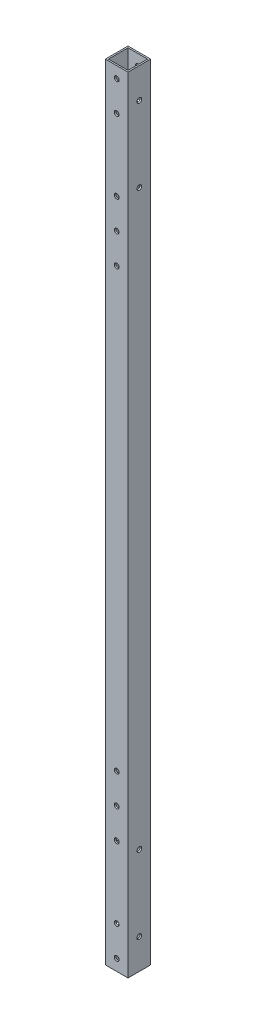
ISO-10303-21;
HEADER;
FILE_DESCRIPTION(('STEP AP214'),'2;1');
FILE_NAME('part.step','',(''),(''),'','','');
FILE_SCHEMA(('AUTOMOTIVE_DESIGN { 1 0 10303 214 1 1 1 1 }'));
ENDSEC;
DATA;
#1=APPLICATION_CONTEXT('core data for automotive mechanical design processes');
#2=APPLICATION_PROTOCOL_DEFINITION('international standard','automotive_design',2000,#1);
#3=PRODUCT_CONTEXT('',#1,'mechanical');
#4=PRODUCT('Part','Part','',(#3));
#5=PRODUCT_RELATED_PRODUCT_CATEGORY('part','',(#4));
#6=PRODUCT_DEFINITION_FORMATION('','',#4);
#7=PRODUCT_DEFINITION_CONTEXT('part definition',#1,'design');
#8=PRODUCT_DEFINITION('design','',#6,#7);
#9=PRODUCT_DEFINITION_SHAPE('','',#8);
#10=(LENGTH_UNIT() NAMED_UNIT(*) SI_UNIT(.MILLI.,.METRE.));
#11=(NAMED_UNIT(*) PLANE_ANGLE_UNIT() SI_UNIT($,.RADIAN.));
#12=(NAMED_UNIT(*) SI_UNIT($,.STERADIAN.) SOLID_ANGLE_UNIT());
#13=UNCERTAINTY_MEASURE_WITH_UNIT(LENGTH_MEASURE(1.E-05),#10,'distance_accuracy_value','');
#14=(GEOMETRIC_REPRESENTATION_CONTEXT(3) GLOBAL_UNCERTAINTY_ASSIGNED_CONTEXT((#13)) GLOBAL_UNIT_ASSIGNED_CONTEXT((#10,
#11,#12)) REPRESENTATION_CONTEXT('',''));
#15=CARTESIAN_POINT('',(0.,0.,0.));
#16=DIRECTION('',(0.,0.,1.));
#17=DIRECTION('',(1.,0.,0.));
#18=AXIS2_PLACEMENT_3D('',#15,#16,#17);
#19=CARTESIAN_POINT('',(0.,520.,0.));
#20=DIRECTION('',(0.,1.,0.));
#21=DIRECTION('',(0.,0.,1.));
#22=AXIS2_PLACEMENT_3D('',#19,#20,#21);
#23=PLANE('',#22);
#24=DIRECTION('',(0.,0.,-1.));
#25=VECTOR('',#24,1.);
#26=CARTESIAN_POINT('',(7.5,520.,7.5));
#27=LINE('',#26,#25);
#28=CARTESIAN_POINT('',(7.5,520.,7.5));
#29=VERTEX_POINT('',#28);
#30=CARTESIAN_POINT('',(7.5,520.,-7.5));
#31=VERTEX_POINT('',#30);
#32=EDGE_CURVE('E186',#29,#31,#27,.T.);
#33=ORIENTED_EDGE('',*,*,#32,.T.);
#34=DIRECTION('',(-1.,0.,0.));
#35=VECTOR('',#34,1.);
#36=CARTESIAN_POINT('',(-7.5,520.,-7.5));
#37=LINE('',#36,#35);
#38=CARTESIAN_POINT('',(-7.5,520.,-7.5));
#39=VERTEX_POINT('',#38);
#40=EDGE_CURVE('E190',#31,#39,#37,.T.);
#41=ORIENTED_EDGE('',*,*,#40,.T.);
#42=DIRECTION('',(0.,0.,1.));
#43=VECTOR('',#42,1.);
#44=CARTESIAN_POINT('',(-7.5,520.,7.5));
#45=LINE('',#44,#43);
#46=CARTESIAN_POINT('',(-7.5,520.,7.5));
#47=VERTEX_POINT('',#46);
#48=EDGE_CURVE('E194',#39,#47,#45,.T.);
#49=ORIENTED_EDGE('',*,*,#48,.T.);
#50=DIRECTION('',(1.,0.,0.));
#51=VECTOR('',#50,1.);
#52=CARTESIAN_POINT('',(-7.5,520.,7.5));
#53=LINE('',#52,#51);
#54=EDGE_CURVE('E197',#47,#29,#53,.T.);
#55=ORIENTED_EDGE('',*,*,#54,.T.);
#56=EDGE_LOOP('',(#33,#41,#49,#55));
#57=FACE_BOUND('',#56,.T.);
#58=DIRECTION('',(-1.,0.,0.));
#59=VECTOR('',#58,1.);
#60=CARTESIAN_POINT('',(0.,520.,-6.5));
#61=LINE('',#60,#59);
#62=CARTESIAN_POINT('',(6.5,520.,-6.5));
#63=VERTEX_POINT('',#62);
#64=CARTESIAN_POINT('',(-6.5,520.,-6.5));
#65=VERTEX_POINT('',#64);
#66=EDGE_CURVE('E145',#63,#65,#61,.T.);
#67=ORIENTED_EDGE('',*,*,#66,.F.);
#68=DIRECTION('',(0.,0.,-1.));
#69=VECTOR('',#68,1.);
#70=CARTESIAN_POINT('',(6.5,520.,0.));
#71=LINE('',#70,#69);
#72=CARTESIAN_POINT('',(6.5,520.,6.5));
#73=VERTEX_POINT('',#72);
#74=EDGE_CURVE('E136',#73,#63,#71,.T.);
#75=ORIENTED_EDGE('',*,*,#74,.F.);
#76=DIRECTION('',(1.,0.,0.));
#77=VECTOR('',#76,1.);
#78=CARTESIAN_POINT('',(0.,520.,6.5));
#79=LINE('',#78,#77);
#80=CARTESIAN_POINT('',(-6.5,520.,6.5));
#81=VERTEX_POINT('',#80);
#82=EDGE_CURVE('E162',#81,#73,#79,.T.);
#83=ORIENTED_EDGE('',*,*,#82,.F.);
#84=DIRECTION('',(0.,0.,1.));
#85=VECTOR('',#84,1.);
#86=CARTESIAN_POINT('',(-6.5,520.,0.));
#87=LINE('',#86,#85);
#88=EDGE_CURVE('E158',#65,#81,#87,.T.);
#89=ORIENTED_EDGE('',*,*,#88,.F.);
#90=EDGE_LOOP('',(#67,#75,#83,#89));
#91=FACE_BOUND('',#90,.T.);
#92=ADVANCED_FACE('F68',(#57,#91),#23,.T.);
#93=CARTESIAN_POINT('',(0.,0.,0.));
#94=DIRECTION('',(0.,1.,0.));
#95=DIRECTION('',(0.,0.,1.));
#96=AXIS2_PLACEMENT_3D('',#93,#94,#95);
#97=PLANE('',#96);
#98=DIRECTION('',(0.,0.,-1.));
#99=VECTOR('',#98,1.);
#100=CARTESIAN_POINT('',(7.5,0.,7.5));
#101=LINE('',#100,#99);
#102=CARTESIAN_POINT('',(7.5,0.,7.5));
#103=VERTEX_POINT('',#102);
#104=CARTESIAN_POINT('',(7.5,0.,-7.5));
#105=VERTEX_POINT('',#104);
#106=EDGE_CURVE('E154',#103,#105,#101,.T.);
#107=ORIENTED_EDGE('',*,*,#106,.F.);
#108=DIRECTION('',(1.,0.,0.));
#109=VECTOR('',#108,1.);
#110=CARTESIAN_POINT('',(-7.5,0.,7.5));
#111=LINE('',#110,#109);
#112=CARTESIAN_POINT('',(-7.5,0.,7.5));
#113=VERTEX_POINT('',#112);
#114=EDGE_CURVE('E191',#113,#103,#111,.T.);
#115=ORIENTED_EDGE('',*,*,#114,.F.);
#116=DIRECTION('',(0.,0.,1.));
#117=VECTOR('',#116,1.);
#118=CARTESIAN_POINT('',(-7.5,0.,7.5));
#119=LINE('',#118,#117);
#120=CARTESIAN_POINT('',(-7.5,0.,-7.5));
#121=VERTEX_POINT('',#120);
#122=EDGE_CURVE('E207',#121,#113,#119,.T.);
#123=ORIENTED_EDGE('',*,*,#122,.F.);
#124=DIRECTION('',(-1.,0.,0.));
#125=VECTOR('',#124,1.);
#126=CARTESIAN_POINT('',(-7.5,0.,-7.5));
#127=LINE('',#126,#125);
#128=EDGE_CURVE('E204',#105,#121,#127,.T.);
#129=ORIENTED_EDGE('',*,*,#128,.F.);
#130=EDGE_LOOP('',(#107,#115,#123,#129));
#131=FACE_BOUND('',#130,.T.);
#132=DIRECTION('',(0.,0.,-1.));
#133=VECTOR('',#132,1.);
#134=CARTESIAN_POINT('',(6.5,0.,0.));
#135=LINE('',#134,#133);
#136=CARTESIAN_POINT('',(6.5,0.,6.5));
#137=VERTEX_POINT('',#136);
#138=CARTESIAN_POINT('',(6.5,0.,-6.5));
#139=VERTEX_POINT('',#138);
#140=EDGE_CURVE('E94',#137,#139,#135,.T.);
#141=ORIENTED_EDGE('',*,*,#140,.T.);
#142=DIRECTION('',(-1.,0.,0.));
#143=VECTOR('',#142,1.);
#144=CARTESIAN_POINT('',(0.,0.,-6.5));
#145=LINE('',#144,#143);
#146=CARTESIAN_POINT('',(-6.5,0.,-6.5));
#147=VERTEX_POINT('',#146);
#148=EDGE_CURVE('E152',#139,#147,#145,.T.);
#149=ORIENTED_EDGE('',*,*,#148,.T.);
#150=DIRECTION('',(0.,0.,1.));
#151=VECTOR('',#150,1.);
#152=CARTESIAN_POINT('',(-6.5,0.,0.));
#153=LINE('',#152,#151);
#154=CARTESIAN_POINT('',(-6.5,0.,6.5));
#155=VERTEX_POINT('',#154);
#156=EDGE_CURVE('E173',#147,#155,#153,.T.);
#157=ORIENTED_EDGE('',*,*,#156,.T.);
#158=DIRECTION('',(1.,0.,0.));
#159=VECTOR('',#158,1.);
#160=CARTESIAN_POINT('',(0.,0.,6.5));
#161=LINE('',#160,#159);
#162=EDGE_CURVE('E146',#155,#137,#161,.T.);
#163=ORIENTED_EDGE('',*,*,#162,.T.);
#164=EDGE_LOOP('',(#141,#149,#157,#163));
#165=FACE_BOUND('',#164,.T.);
#166=ADVANCED_FACE('F460',(#131,#165),#97,.F.);
#167=CARTESIAN_POINT('',(7.5,520.,7.5));
#168=DIRECTION('',(-1.,0.,0.));
#169=DIRECTION('',(0.,0.,1.));
#170=AXIS2_PLACEMENT_3D('',#167,#168,#169);
#171=PLANE('',#170);
#172=CARTESIAN_POINT('',(7.5,20.,0.));
#173=DIRECTION('',(1.,0.,0.));
#174=DIRECTION('',(0.,0.,-1.));
#175=AXIS2_PLACEMENT_3D('',#172,#173,#174);
#176=CIRCLE('',#175,1.6);
#177=CARTESIAN_POINT('',(7.5,20.,-1.6));
#178=VERTEX_POINT('',#177);
#179=EDGE_CURVE('E519',#178,#178,#176,.T.);
#180=ORIENTED_EDGE('',*,*,#179,.F.);
#181=EDGE_LOOP('',(#180));
#182=FACE_BOUND('',#181,.T.);
#183=CARTESIAN_POINT('',(7.5,70.,0.));
#184=DIRECTION('',(1.,0.,0.));
#185=DIRECTION('',(0.,0.,-1.));
#186=AXIS2_PLACEMENT_3D('',#183,#184,#185);
#187=CIRCLE('',#186,1.6);
#188=CARTESIAN_POINT('',(7.5,70.,-1.6));
#189=VERTEX_POINT('',#188);
#190=EDGE_CURVE('E515',#189,#189,#187,.T.);
#191=ORIENTED_EDGE('',*,*,#190,.F.);
#192=EDGE_LOOP('',(#191));
#193=FACE_BOUND('',#192,.T.);
#194=CARTESIAN_POINT('',(7.5,450.,0.));
#195=DIRECTION('',(1.,0.,0.));
#196=DIRECTION('',(0.,0.,1.));
#197=AXIS2_PLACEMENT_3D('',#194,#195,#196);
#198=CIRCLE('',#197,1.59999999999999);
#199=CARTESIAN_POINT('',(7.5,450.,1.59999999999999));
#200=VERTEX_POINT('',#199);
#201=EDGE_CURVE('E509',#200,#200,#198,.T.);
#202=ORIENTED_EDGE('',*,*,#201,.F.);
#203=EDGE_LOOP('',(#202));
#204=FACE_BOUND('',#203,.T.);
#205=CARTESIAN_POINT('',(7.5,500.,0.));
#206=DIRECTION('',(1.,0.,0.));
#207=DIRECTION('',(0.,0.,1.));
#208=AXIS2_PLACEMENT_3D('',#205,#206,#207);
#209=CIRCLE('',#208,1.6);
#210=CARTESIAN_POINT('',(7.5,500.,1.6));
#211=VERTEX_POINT('',#210);
#212=EDGE_CURVE('E502',#211,#211,#209,.T.);
#213=ORIENTED_EDGE('',*,*,#212,.F.);
#214=EDGE_LOOP('',(#213));
#215=FACE_BOUND('',#214,.T.);
#216=ORIENTED_EDGE('',*,*,#106,.T.);
#217=DIRECTION('',(0.,-1.,0.));
#218=VECTOR('',#217,1.);
#219=CARTESIAN_POINT('',(7.5,520.,-7.5));
#220=LINE('',#219,#218);
#221=EDGE_CURVE('E12',#31,#105,#220,.T.);
#222=ORIENTED_EDGE('',*,*,#221,.F.);
#223=ORIENTED_EDGE('',*,*,#32,.F.);
#224=DIRECTION('',(0.,-1.,0.));
#225=VECTOR('',#224,1.);
#226=CARTESIAN_POINT('',(7.5,520.,7.5));
#227=LINE('',#226,#225);
#228=EDGE_CURVE('E200',#29,#103,#227,.T.);
#229=ORIENTED_EDGE('',*,*,#228,.T.);
#230=EDGE_LOOP('',(#216,#222,#223,#229));
#231=FACE_BOUND('',#230,.T.);
#232=ADVANCED_FACE('F70',(#182,#193,#204,#215,#231),#171,.F.);
#233=CARTESIAN_POINT('',(-7.5,520.,-7.5));
#234=DIRECTION('',(0.,0.,1.));
#235=DIRECTION('',(1.,0.,0.));
#236=AXIS2_PLACEMENT_3D('',#233,#234,#235);
#237=PLANE('',#236);
#238=CARTESIAN_POINT('',(0.,7.5,-7.5));
#239=DIRECTION('',(0.,0.,1.));
#240=DIRECTION('',(1.,0.,0.));
#241=AXIS2_PLACEMENT_3D('',#238,#239,#240);
#242=CIRCLE('',#241,1.6);
#243=CARTESIAN_POINT('',(1.6,7.5,-7.5));
#244=VERTEX_POINT('',#243);
#245=EDGE_CURVE('E227',#244,#244,#242,.T.);
#246=ORIENTED_EDGE('',*,*,#245,.T.);
#247=EDGE_LOOP('',(#246));
#248=FACE_BOUND('',#247,.T.);
#249=CARTESIAN_POINT('',(0.,27.5,-7.5));
#250=DIRECTION('',(0.,0.,1.));
#251=DIRECTION('',(1.,0.,0.));
#252=AXIS2_PLACEMENT_3D('',#249,#250,#251);
#253=CIRCLE('',#252,1.6);
#254=CARTESIAN_POINT('',(1.6,27.5,-7.5));
#255=VERTEX_POINT('',#254);
#256=EDGE_CURVE('E315',#255,#255,#253,.T.);
#257=ORIENTED_EDGE('',*,*,#256,.T.);
#258=EDGE_LOOP('',(#257));
#259=FACE_BOUND('',#258,.T.);
#260=CARTESIAN_POINT('',(0.,75.,-7.5));
#261=DIRECTION('',(0.,0.,1.));
#262=DIRECTION('',(1.,0.,0.));
#263=AXIS2_PLACEMENT_3D('',#260,#261,#262);
#264=CIRCLE('',#263,1.6);
#265=CARTESIAN_POINT('',(1.6,75.,-7.5));
#266=VERTEX_POINT('',#265);
#267=EDGE_CURVE('E323',#266,#266,#264,.T.);
#268=ORIENTED_EDGE('',*,*,#267,.T.);
#269=EDGE_LOOP('',(#268));
#270=FACE_BOUND('',#269,.T.);
#271=CARTESIAN_POINT('',(0.,95.,-7.5));
#272=DIRECTION('',(0.,0.,1.));
#273=DIRECTION('',(1.,0.,0.));
#274=AXIS2_PLACEMENT_3D('',#271,#272,#273);
#275=CIRCLE('',#274,1.6);
#276=CARTESIAN_POINT('',(1.6,95.,-7.5));
#277=VERTEX_POINT('',#276);
#278=EDGE_CURVE('E331',#277,#277,#275,.T.);
#279=ORIENTED_EDGE('',*,*,#278,.T.);
#280=EDGE_LOOP('',(#279));
#281=FACE_BOUND('',#280,.T.);
#282=CARTESIAN_POINT('',(0.,115.,-7.5));
#283=DIRECTION('',(0.,0.,1.));
#284=DIRECTION('',(1.,0.,0.));
#285=AXIS2_PLACEMENT_3D('',#282,#283,#284);
#286=CIRCLE('',#285,1.6);
#287=CARTESIAN_POINT('',(1.6,115.,-7.5));
#288=VERTEX_POINT('',#287);
#289=EDGE_CURVE('E339',#288,#288,#286,.T.);
#290=ORIENTED_EDGE('',*,*,#289,.T.);
#291=EDGE_LOOP('',(#290));
#292=FACE_BOUND('',#291,.T.);
#293=CARTESIAN_POINT('',(0.,405.,-7.5));
#294=DIRECTION('',(0.,0.,1.));
#295=DIRECTION('',(-1.,0.,0.));
#296=AXIS2_PLACEMENT_3D('',#293,#294,#295);
#297=CIRCLE('',#296,1.6);
#298=CARTESIAN_POINT('',(-1.6,405.,-7.5));
#299=VERTEX_POINT('',#298);
#300=EDGE_CURVE('E347',#299,#299,#297,.T.);
#301=ORIENTED_EDGE('',*,*,#300,.T.);
#302=EDGE_LOOP('',(#301));
#303=FACE_BOUND('',#302,.T.);
#304=CARTESIAN_POINT('',(0.,425.,-7.5));
#305=DIRECTION('',(0.,0.,1.));
#306=DIRECTION('',(-1.,0.,0.));
#307=AXIS2_PLACEMENT_3D('',#304,#305,#306);
#308=CIRCLE('',#307,1.60000000000001);
#309=CARTESIAN_POINT('',(-1.60000000000001,425.,-7.5));
#310=VERTEX_POINT('',#309);
#311=EDGE_CURVE('E355',#310,#310,#308,.T.);
#312=ORIENTED_EDGE('',*,*,#311,.T.);
#313=EDGE_LOOP('',(#312));
#314=FACE_BOUND('',#313,.T.);
#315=CARTESIAN_POINT('',(0.,445.,-7.5));
#316=DIRECTION('',(0.,0.,1.));
#317=DIRECTION('',(-1.,0.,0.));
#318=AXIS2_PLACEMENT_3D('',#315,#316,#317);
#319=CIRCLE('',#318,1.6);
#320=CARTESIAN_POINT('',(-1.6,445.,-7.5));
#321=VERTEX_POINT('',#320);
#322=EDGE_CURVE('E363',#321,#321,#319,.T.);
#323=ORIENTED_EDGE('',*,*,#322,.T.);
#324=EDGE_LOOP('',(#323));
#325=FACE_BOUND('',#324,.T.);
#326=CARTESIAN_POINT('',(0.,492.5,-7.5));
#327=DIRECTION('',(0.,0.,1.));
#328=DIRECTION('',(-1.,0.,0.));
#329=AXIS2_PLACEMENT_3D('',#326,#327,#328);
#330=CIRCLE('',#329,1.60000000000001);
#331=CARTESIAN_POINT('',(-1.60000000000001,492.5,-7.5));
#332=VERTEX_POINT('',#331);
#333=EDGE_CURVE('E371',#332,#332,#330,.T.);
#334=ORIENTED_EDGE('',*,*,#333,.T.);
#335=EDGE_LOOP('',(#334));
#336=FACE_BOUND('',#335,.T.);
#337=CARTESIAN_POINT('',(0.,512.5,-7.5));
#338=DIRECTION('',(0.,0.,1.));
#339=DIRECTION('',(-1.,0.,0.));
#340=AXIS2_PLACEMENT_3D('',#337,#338,#339);
#341=CIRCLE('',#340,1.6);
#342=CARTESIAN_POINT('',(-1.6,512.5,-7.5));
#343=VERTEX_POINT('',#342);
#344=EDGE_CURVE('E303',#343,#343,#341,.T.);
#345=ORIENTED_EDGE('',*,*,#344,.T.);
#346=EDGE_LOOP('',(#345));
#347=FACE_BOUND('',#346,.T.);
#348=ORIENTED_EDGE('',*,*,#128,.T.);
#349=DIRECTION('',(0.,-1.,0.));
#350=VECTOR('',#349,1.);
#351=CARTESIAN_POINT('',(-7.5,520.,-7.5));
#352=LINE('',#351,#350);
#353=EDGE_CURVE('E78',#39,#121,#352,.T.);
#354=ORIENTED_EDGE('',*,*,#353,.F.);
#355=ORIENTED_EDGE('',*,*,#40,.F.);
#356=ORIENTED_EDGE('',*,*,#221,.T.);
#357=EDGE_LOOP('',(#348,#354,#355,#356));
#358=FACE_BOUND('',#357,.T.);
#359=ADVANCED_FACE('F446',(#248,#259,#270,#281,#292,#303,#314,#325,#336,#347,#358),#237,.F.);
#360=CARTESIAN_POINT('',(-7.5,520.,7.5));
#361=DIRECTION('',(1.,0.,0.));
#362=DIRECTION('',(0.,0.,-1.));
#363=AXIS2_PLACEMENT_3D('',#360,#361,#362);
#364=PLANE('',#363);
#365=CARTESIAN_POINT('',(-7.5,20.,0.));
#366=DIRECTION('',(1.,0.,0.));
#367=DIRECTION('',(0.,0.,-1.));
#368=AXIS2_PLACEMENT_3D('',#365,#366,#367);
#369=CIRCLE('',#368,1.6);
#370=CARTESIAN_POINT('',(-7.5,20.,-1.6));
#371=VERTEX_POINT('',#370);
#372=EDGE_CURVE('E277',#371,#371,#369,.T.);
#373=ORIENTED_EDGE('',*,*,#372,.T.);
#374=EDGE_LOOP('',(#373));
#375=FACE_BOUND('',#374,.T.);
#376=CARTESIAN_POINT('',(-7.5,70.,0.));
#377=DIRECTION('',(1.,0.,0.));
#378=DIRECTION('',(0.,0.,-1.));
#379=AXIS2_PLACEMENT_3D('',#376,#377,#378);
#380=CIRCLE('',#379,1.6);
#381=CARTESIAN_POINT('',(-7.5,70.,-1.6));
#382=VERTEX_POINT('',#381);
#383=EDGE_CURVE('E492',#382,#382,#380,.T.);
#384=ORIENTED_EDGE('',*,*,#383,.T.);
#385=EDGE_LOOP('',(#384));
#386=FACE_BOUND('',#385,.T.);
#387=CARTESIAN_POINT('',(-7.5,450.,0.));
#388=DIRECTION('',(1.,0.,0.));
#389=DIRECTION('',(0.,0.,1.));
#390=AXIS2_PLACEMENT_3D('',#387,#388,#389);
#391=CIRCLE('',#390,1.59999999999999);
#392=CARTESIAN_POINT('',(-7.5,450.,1.59999999999999));
#393=VERTEX_POINT('',#392);
#394=EDGE_CURVE('E496',#393,#393,#391,.T.);
#395=ORIENTED_EDGE('',*,*,#394,.T.);
#396=EDGE_LOOP('',(#395));
#397=FACE_BOUND('',#396,.T.);
#398=CARTESIAN_POINT('',(-7.5,500.,0.));
#399=DIRECTION('',(1.,0.,0.));
#400=DIRECTION('',(0.,0.,1.));
#401=AXIS2_PLACEMENT_3D('',#398,#399,#400);
#402=CIRCLE('',#401,1.6);
#403=CARTESIAN_POINT('',(-7.5,500.,1.6));
#404=VERTEX_POINT('',#403);
#405=EDGE_CURVE('E499',#404,#404,#402,.T.);
#406=ORIENTED_EDGE('',*,*,#405,.T.);
#407=EDGE_LOOP('',(#406));
#408=FACE_BOUND('',#407,.T.);
#409=ORIENTED_EDGE('',*,*,#122,.T.);
#410=DIRECTION('',(0.,-1.,0.));
#411=VECTOR('',#410,1.);
#412=CARTESIAN_POINT('',(-7.5,520.,7.5));
#413=LINE('',#412,#411);
#414=EDGE_CURVE('E215',#47,#113,#413,.T.);
#415=ORIENTED_EDGE('',*,*,#414,.F.);
#416=ORIENTED_EDGE('',*,*,#48,.F.);
#417=ORIENTED_EDGE('',*,*,#353,.T.);
#418=EDGE_LOOP('',(#409,#415,#416,#417));
#419=FACE_BOUND('',#418,.T.);
#420=ADVANCED_FACE('F449',(#375,#386,#397,#408,#419),#364,.F.);
#421=CARTESIAN_POINT('',(-7.5,520.,7.5));
#422=DIRECTION('',(0.,0.,-1.));
#423=DIRECTION('',(-1.,0.,0.));
#424=AXIS2_PLACEMENT_3D('',#421,#422,#423);
#425=PLANE('',#424);
#426=CARTESIAN_POINT('',(0.,7.5,7.5));
#427=DIRECTION('',(0.,0.,1.));
#428=DIRECTION('',(1.,0.,0.));
#429=AXIS2_PLACEMENT_3D('',#426,#427,#428);
#430=CIRCLE('',#429,1.6);
#431=CARTESIAN_POINT('',(1.6,7.5,7.5));
#432=VERTEX_POINT('',#431);
#433=EDGE_CURVE('E307',#432,#432,#430,.T.);
#434=ORIENTED_EDGE('',*,*,#433,.F.);
#435=EDGE_LOOP('',(#434));
#436=FACE_BOUND('',#435,.T.);
#437=CARTESIAN_POINT('',(0.,27.5,7.5));
#438=DIRECTION('',(0.,0.,1.));
#439=DIRECTION('',(1.,0.,0.));
#440=AXIS2_PLACEMENT_3D('',#437,#438,#439);
#441=CIRCLE('',#440,1.6);
#442=CARTESIAN_POINT('',(1.6,27.5,7.5));
#443=VERTEX_POINT('',#442);
#444=EDGE_CURVE('E311',#443,#443,#441,.T.);
#445=ORIENTED_EDGE('',*,*,#444,.F.);
#446=EDGE_LOOP('',(#445));
#447=FACE_BOUND('',#446,.T.);
#448=CARTESIAN_POINT('',(0.,75.,7.5));
#449=DIRECTION('',(0.,0.,1.));
#450=DIRECTION('',(1.,0.,0.));
#451=AXIS2_PLACEMENT_3D('',#448,#449,#450);
#452=CIRCLE('',#451,1.6);
#453=CARTESIAN_POINT('',(1.6,75.,7.5));
#454=VERTEX_POINT('',#453);
#455=EDGE_CURVE('E319',#454,#454,#452,.T.);
#456=ORIENTED_EDGE('',*,*,#455,.F.);
#457=EDGE_LOOP('',(#456));
#458=FACE_BOUND('',#457,.T.);
#459=CARTESIAN_POINT('',(0.,95.,7.5));
#460=DIRECTION('',(0.,0.,1.));
#461=DIRECTION('',(1.,0.,0.));
#462=AXIS2_PLACEMENT_3D('',#459,#460,#461);
#463=CIRCLE('',#462,1.6);
#464=CARTESIAN_POINT('',(1.6,95.,7.5));
#465=VERTEX_POINT('',#464);
#466=EDGE_CURVE('E327',#465,#465,#463,.T.);
#467=ORIENTED_EDGE('',*,*,#466,.F.);
#468=EDGE_LOOP('',(#467));
#469=FACE_BOUND('',#468,.T.);
#470=CARTESIAN_POINT('',(0.,115.,7.5));
#471=DIRECTION('',(0.,0.,1.));
#472=DIRECTION('',(1.,0.,0.));
#473=AXIS2_PLACEMENT_3D('',#470,#471,#472);
#474=CIRCLE('',#473,1.6);
#475=CARTESIAN_POINT('',(1.6,115.,7.5));
#476=VERTEX_POINT('',#475);
#477=EDGE_CURVE('E335',#476,#476,#474,.T.);
#478=ORIENTED_EDGE('',*,*,#477,.F.);
#479=EDGE_LOOP('',(#478));
#480=FACE_BOUND('',#479,.T.);
#481=CARTESIAN_POINT('',(0.,405.,7.5));
#482=DIRECTION('',(0.,0.,1.));
#483=DIRECTION('',(-1.,0.,0.));
#484=AXIS2_PLACEMENT_3D('',#481,#482,#483);
#485=CIRCLE('',#484,1.6);
#486=CARTESIAN_POINT('',(-1.6,405.,7.5));
#487=VERTEX_POINT('',#486);
#488=EDGE_CURVE('E343',#487,#487,#485,.T.);
#489=ORIENTED_EDGE('',*,*,#488,.F.);
#490=EDGE_LOOP('',(#489));
#491=FACE_BOUND('',#490,.T.);
#492=CARTESIAN_POINT('',(0.,425.,7.5));
#493=DIRECTION('',(0.,0.,1.));
#494=DIRECTION('',(-1.,0.,0.));
#495=AXIS2_PLACEMENT_3D('',#492,#493,#494);
#496=CIRCLE('',#495,1.60000000000001);
#497=CARTESIAN_POINT('',(-1.60000000000001,425.,7.5));
#498=VERTEX_POINT('',#497);
#499=EDGE_CURVE('E351',#498,#498,#496,.T.);
#500=ORIENTED_EDGE('',*,*,#499,.F.);
#501=EDGE_LOOP('',(#500));
#502=FACE_BOUND('',#501,.T.);
#503=CARTESIAN_POINT('',(0.,445.,7.5));
#504=DIRECTION('',(0.,0.,1.));
#505=DIRECTION('',(-1.,0.,0.));
#506=AXIS2_PLACEMENT_3D('',#503,#504,#505);
#507=CIRCLE('',#506,1.6);
#508=CARTESIAN_POINT('',(-1.6,445.,7.5));
#509=VERTEX_POINT('',#508);
#510=EDGE_CURVE('E359',#509,#509,#507,.T.);
#511=ORIENTED_EDGE('',*,*,#510,.F.);
#512=EDGE_LOOP('',(#511));
#513=FACE_BOUND('',#512,.T.);
#514=CARTESIAN_POINT('',(0.,492.5,7.5));
#515=DIRECTION('',(0.,0.,1.));
#516=DIRECTION('',(-1.,0.,0.));
#517=AXIS2_PLACEMENT_3D('',#514,#515,#516);
#518=CIRCLE('',#517,1.60000000000001);
#519=CARTESIAN_POINT('',(-1.60000000000001,492.5,7.5));
#520=VERTEX_POINT('',#519);
#521=EDGE_CURVE('E367',#520,#520,#518,.T.);
#522=ORIENTED_EDGE('',*,*,#521,.F.);
#523=EDGE_LOOP('',(#522));
#524=FACE_BOUND('',#523,.T.);
#525=CARTESIAN_POINT('',(0.,512.5,7.5));
#526=DIRECTION('',(0.,0.,1.));
#527=DIRECTION('',(-1.,0.,0.));
#528=AXIS2_PLACEMENT_3D('',#525,#526,#527);
#529=CIRCLE('',#528,1.6);
#530=CARTESIAN_POINT('',(-1.6,512.5,7.5));
#531=VERTEX_POINT('',#530);
#532=EDGE_CURVE('E375',#531,#531,#529,.T.);
#533=ORIENTED_EDGE('',*,*,#532,.F.);
#534=EDGE_LOOP('',(#533));
#535=FACE_BOUND('',#534,.T.);
#536=ORIENTED_EDGE('',*,*,#114,.T.);
#537=ORIENTED_EDGE('',*,*,#228,.F.);
#538=ORIENTED_EDGE('',*,*,#54,.F.);
#539=ORIENTED_EDGE('',*,*,#414,.T.);
#540=EDGE_LOOP('',(#536,#537,#538,#539));
#541=FACE_BOUND('',#540,.T.);
#542=ADVANCED_FACE('F464',(#436,#447,#458,#469,#480,#491,#502,#513,#524,#535,#541),#425,.F.);
#543=CARTESIAN_POINT('',(6.5,520.,0.));
#544=DIRECTION('',(-1.,0.,0.));
#545=DIRECTION('',(0.,0.,1.));
#546=AXIS2_PLACEMENT_3D('',#543,#544,#545);
#547=PLANE('',#546);
#548=CARTESIAN_POINT('',(6.5,20.,0.));
#549=DIRECTION('',(-1.,0.,0.));
#550=DIRECTION('',(0.,0.,1.));
#551=AXIS2_PLACEMENT_3D('',#548,#549,#550);
#552=CIRCLE('',#551,1.6);
#553=CARTESIAN_POINT('',(6.5,20.,1.6));
#554=VERTEX_POINT('',#553);
#555=EDGE_CURVE('E299',#554,#554,#552,.T.);
#556=ORIENTED_EDGE('',*,*,#555,.F.);
#557=EDGE_LOOP('',(#556));
#558=FACE_BOUND('',#557,.T.);
#559=CARTESIAN_POINT('',(6.5,70.,0.));
#560=DIRECTION('',(-1.,0.,0.));
#561=DIRECTION('',(0.,0.,1.));
#562=AXIS2_PLACEMENT_3D('',#559,#560,#561);
#563=CIRCLE('',#562,1.6);
#564=CARTESIAN_POINT('',(6.5,70.,1.6));
#565=VERTEX_POINT('',#564);
#566=EDGE_CURVE('E285',#565,#565,#563,.T.);
#567=ORIENTED_EDGE('',*,*,#566,.F.);
#568=EDGE_LOOP('',(#567));
#569=FACE_BOUND('',#568,.T.);
#570=CARTESIAN_POINT('',(6.5,450.,0.));
#571=DIRECTION('',(-1.,0.,0.));
#572=DIRECTION('',(0.,0.,1.));
#573=AXIS2_PLACEMENT_3D('',#570,#571,#572);
#574=CIRCLE('',#573,1.59999999999999);
#575=CARTESIAN_POINT('',(6.5,450.,1.59999999999999));
#576=VERTEX_POINT('',#575);
#577=EDGE_CURVE('E281',#576,#576,#574,.T.);
#578=ORIENTED_EDGE('',*,*,#577,.F.);
#579=EDGE_LOOP('',(#578));
#580=FACE_BOUND('',#579,.T.);
#581=CARTESIAN_POINT('',(6.5,500.,0.));
#582=DIRECTION('',(-1.,0.,0.));
#583=DIRECTION('',(0.,0.,1.));
#584=AXIS2_PLACEMENT_3D('',#581,#582,#583);
#585=CIRCLE('',#584,1.6);
#586=CARTESIAN_POINT('',(6.5,500.,1.6));
#587=VERTEX_POINT('',#586);
#588=EDGE_CURVE('E276',#587,#587,#585,.T.);
#589=ORIENTED_EDGE('',*,*,#588,.F.);
#590=EDGE_LOOP('',(#589));
#591=FACE_BOUND('',#590,.T.);
#592=ORIENTED_EDGE('',*,*,#140,.F.);
#593=DIRECTION('',(0.,-1.,0.));
#594=VECTOR('',#593,1.);
#595=CARTESIAN_POINT('',(6.5,520.,6.5));
#596=LINE('',#595,#594);
#597=EDGE_CURVE('E140',#73,#137,#596,.T.);
#598=ORIENTED_EDGE('',*,*,#597,.F.);
#599=ORIENTED_EDGE('',*,*,#74,.T.);
#600=DIRECTION('',(0.,-1.,0.));
#601=VECTOR('',#600,1.);
#602=CARTESIAN_POINT('',(6.5,520.,-6.5));
#603=LINE('',#602,#601);
#604=EDGE_CURVE('E139',#63,#139,#603,.T.);
#605=ORIENTED_EDGE('',*,*,#604,.T.);
#606=EDGE_LOOP('',(#592,#598,#599,#605));
#607=FACE_BOUND('',#606,.T.);
#608=ADVANCED_FACE('F138',(#558,#569,#580,#591,#607),#547,.T.);
#609=CARTESIAN_POINT('',(0.,520.,-6.5));
#610=DIRECTION('',(0.,0.,1.));
#611=DIRECTION('',(1.,0.,0.));
#612=AXIS2_PLACEMENT_3D('',#609,#610,#611);
#613=PLANE('',#612);
#614=CARTESIAN_POINT('',(0.,7.5,-6.5));
#615=DIRECTION('',(0.,0.,1.));
#616=DIRECTION('',(1.,0.,0.));
#617=AXIS2_PLACEMENT_3D('',#614,#615,#616);
#618=CIRCLE('',#617,1.6);
#619=CARTESIAN_POINT('',(1.6,7.5,-6.5));
#620=VERTEX_POINT('',#619);
#621=EDGE_CURVE('E170',#620,#620,#618,.T.);
#622=ORIENTED_EDGE('',*,*,#621,.F.);
#623=EDGE_LOOP('',(#622));
#624=FACE_BOUND('',#623,.T.);
#625=CARTESIAN_POINT('',(0.,27.5,-6.5));
#626=DIRECTION('',(0.,0.,1.));
#627=DIRECTION('',(1.,0.,0.));
#628=AXIS2_PLACEMENT_3D('',#625,#626,#627);
#629=CIRCLE('',#628,1.6);
#630=CARTESIAN_POINT('',(1.6,27.5,-6.5));
#631=VERTEX_POINT('',#630);
#632=EDGE_CURVE('E267',#631,#631,#629,.T.);
#633=ORIENTED_EDGE('',*,*,#632,.F.);
#634=EDGE_LOOP('',(#633));
#635=FACE_BOUND('',#634,.T.);
#636=CARTESIAN_POINT('',(0.,75.,-6.5));
#637=DIRECTION('',(0.,0.,1.));
#638=DIRECTION('',(1.,0.,0.));
#639=AXIS2_PLACEMENT_3D('',#636,#637,#638);
#640=CIRCLE('',#639,1.6);
#641=CARTESIAN_POINT('',(1.6,75.,-6.5));
#642=VERTEX_POINT('',#641);
#643=EDGE_CURVE('E262',#642,#642,#640,.T.);
#644=ORIENTED_EDGE('',*,*,#643,.F.);
#645=EDGE_LOOP('',(#644));
#646=FACE_BOUND('',#645,.T.);
#647=CARTESIAN_POINT('',(0.,95.,-6.5));
#648=DIRECTION('',(0.,0.,1.));
#649=DIRECTION('',(1.,0.,0.));
#650=AXIS2_PLACEMENT_3D('',#647,#648,#649);
#651=CIRCLE('',#650,1.6);
#652=CARTESIAN_POINT('',(1.6,95.,-6.5));
#653=VERTEX_POINT('',#652);
#654=EDGE_CURVE('E257',#653,#653,#651,.T.);
#655=ORIENTED_EDGE('',*,*,#654,.F.);
#656=EDGE_LOOP('',(#655));
#657=FACE_BOUND('',#656,.T.);
#658=CARTESIAN_POINT('',(0.,115.,-6.5));
#659=DIRECTION('',(0.,0.,1.));
#660=DIRECTION('',(1.,0.,0.));
#661=AXIS2_PLACEMENT_3D('',#658,#659,#660);
#662=CIRCLE('',#661,1.6);
#663=CARTESIAN_POINT('',(1.6,115.,-6.5));
#664=VERTEX_POINT('',#663);
#665=EDGE_CURVE('E252',#664,#664,#662,.T.);
#666=ORIENTED_EDGE('',*,*,#665,.F.);
#667=EDGE_LOOP('',(#666));
#668=FACE_BOUND('',#667,.T.);
#669=CARTESIAN_POINT('',(0.,405.,-6.5));
#670=DIRECTION('',(0.,0.,1.));
#671=DIRECTION('',(1.,0.,0.));
#672=AXIS2_PLACEMENT_3D('',#669,#670,#671);
#673=CIRCLE('',#672,1.6);
#674=CARTESIAN_POINT('',(1.6,405.,-6.5));
#675=VERTEX_POINT('',#674);
#676=EDGE_CURVE('E247',#675,#675,#673,.T.);
#677=ORIENTED_EDGE('',*,*,#676,.F.);
#678=EDGE_LOOP('',(#677));
#679=FACE_BOUND('',#678,.T.);
#680=CARTESIAN_POINT('',(0.,425.,-6.5));
#681=DIRECTION('',(0.,0.,1.));
#682=DIRECTION('',(1.,0.,0.));
#683=AXIS2_PLACEMENT_3D('',#680,#681,#682);
#684=CIRCLE('',#683,1.60000000000001);
#685=CARTESIAN_POINT('',(1.60000000000001,425.,-6.5));
#686=VERTEX_POINT('',#685);
#687=EDGE_CURVE('E242',#686,#686,#684,.T.);
#688=ORIENTED_EDGE('',*,*,#687,.F.);
#689=EDGE_LOOP('',(#688));
#690=FACE_BOUND('',#689,.T.);
#691=CARTESIAN_POINT('',(0.,445.,-6.5));
#692=DIRECTION('',(0.,0.,1.));
#693=DIRECTION('',(1.,0.,0.));
#694=AXIS2_PLACEMENT_3D('',#691,#692,#693);
#695=CIRCLE('',#694,1.6);
#696=CARTESIAN_POINT('',(1.6,445.,-6.5));
#697=VERTEX_POINT('',#696);
#698=EDGE_CURVE('E237',#697,#697,#695,.T.);
#699=ORIENTED_EDGE('',*,*,#698,.F.);
#700=EDGE_LOOP('',(#699));
#701=FACE_BOUND('',#700,.T.);
#702=CARTESIAN_POINT('',(0.,492.5,-6.5));
#703=DIRECTION('',(0.,0.,1.));
#704=DIRECTION('',(1.,0.,0.));
#705=AXIS2_PLACEMENT_3D('',#702,#703,#704);
#706=CIRCLE('',#705,1.60000000000001);
#707=CARTESIAN_POINT('',(1.60000000000001,492.5,-6.5));
#708=VERTEX_POINT('',#707);
#709=EDGE_CURVE('E232',#708,#708,#706,.T.);
#710=ORIENTED_EDGE('',*,*,#709,.F.);
#711=EDGE_LOOP('',(#710));
#712=FACE_BOUND('',#711,.T.);
#713=CARTESIAN_POINT('',(0.,512.5,-6.5));
#714=DIRECTION('',(0.,0.,1.));
#715=DIRECTION('',(1.,0.,0.));
#716=AXIS2_PLACEMENT_3D('',#713,#714,#715);
#717=CIRCLE('',#716,1.6);
#718=CARTESIAN_POINT('',(1.6,512.5,-6.5));
#719=VERTEX_POINT('',#718);
#720=EDGE_CURVE('E226',#719,#719,#717,.T.);
#721=ORIENTED_EDGE('',*,*,#720,.F.);
#722=EDGE_LOOP('',(#721));
#723=FACE_BOUND('',#722,.T.);
#724=ORIENTED_EDGE('',*,*,#148,.F.);
#725=ORIENTED_EDGE('',*,*,#604,.F.);
#726=ORIENTED_EDGE('',*,*,#66,.T.);
#727=DIRECTION('',(0.,-1.,0.));
#728=VECTOR('',#727,1.);
#729=CARTESIAN_POINT('',(-6.5,520.,-6.5));
#730=LINE('',#729,#728);
#731=EDGE_CURVE('E155',#65,#147,#730,.T.);
#732=ORIENTED_EDGE('',*,*,#731,.T.);
#733=EDGE_LOOP('',(#724,#725,#726,#732));
#734=FACE_BOUND('',#733,.T.);
#735=ADVANCED_FACE('F149',(#624,#635,#646,#657,#668,#679,#690,#701,#712,#723,#734),#613,.T.);
#736=CARTESIAN_POINT('',(-6.5,520.,0.));
#737=DIRECTION('',(1.,0.,0.));
#738=DIRECTION('',(0.,0.,-1.));
#739=AXIS2_PLACEMENT_3D('',#736,#737,#738);
#740=PLANE('',#739);
#741=CARTESIAN_POINT('',(-6.5,20.,0.));
#742=DIRECTION('',(1.,0.,0.));
#743=DIRECTION('',(0.,0.,-1.));
#744=AXIS2_PLACEMENT_3D('',#741,#742,#743);
#745=CIRCLE('',#744,1.6);
#746=CARTESIAN_POINT('',(-6.5,20.,-1.6));
#747=VERTEX_POINT('',#746);
#748=EDGE_CURVE('E72',#747,#747,#745,.T.);
#749=ORIENTED_EDGE('',*,*,#748,.F.);
#750=EDGE_LOOP('',(#749));
#751=FACE_BOUND('',#750,.T.);
#752=CARTESIAN_POINT('',(-6.5,70.,0.));
#753=DIRECTION('',(1.,0.,0.));
#754=DIRECTION('',(0.,0.,-1.));
#755=AXIS2_PLACEMENT_3D('',#752,#753,#754);
#756=CIRCLE('',#755,1.6);
#757=CARTESIAN_POINT('',(-6.5,70.,-1.6));
#758=VERTEX_POINT('',#757);
#759=EDGE_CURVE('E282',#758,#758,#756,.T.);
#760=ORIENTED_EDGE('',*,*,#759,.F.);
#761=EDGE_LOOP('',(#760));
#762=FACE_BOUND('',#761,.T.);
#763=CARTESIAN_POINT('',(-6.5,450.,0.));
#764=DIRECTION('',(1.,0.,0.));
#765=DIRECTION('',(0.,0.,-1.));
#766=AXIS2_PLACEMENT_3D('',#763,#764,#765);
#767=CIRCLE('',#766,1.59999999999999);
#768=CARTESIAN_POINT('',(-6.5,450.,-1.59999999999999));
#769=VERTEX_POINT('',#768);
#770=EDGE_CURVE('E278',#769,#769,#767,.T.);
#771=ORIENTED_EDGE('',*,*,#770,.F.);
#772=EDGE_LOOP('',(#771));
#773=FACE_BOUND('',#772,.T.);
#774=CARTESIAN_POINT('',(-6.5,500.,0.));
#775=DIRECTION('',(1.,0.,0.));
#776=DIRECTION('',(0.,0.,-1.));
#777=AXIS2_PLACEMENT_3D('',#774,#775,#776);
#778=CIRCLE('',#777,1.6);
#779=CARTESIAN_POINT('',(-6.5,500.,-1.6));
#780=VERTEX_POINT('',#779);
#781=EDGE_CURVE('E272',#780,#780,#778,.T.);
#782=ORIENTED_EDGE('',*,*,#781,.F.);
#783=EDGE_LOOP('',(#782));
#784=FACE_BOUND('',#783,.T.);
#785=ORIENTED_EDGE('',*,*,#156,.F.);
#786=ORIENTED_EDGE('',*,*,#731,.F.);
#787=ORIENTED_EDGE('',*,*,#88,.T.);
#788=DIRECTION('',(0.,-1.,0.));
#789=VECTOR('',#788,1.);
#790=CARTESIAN_POINT('',(-6.5,520.,6.5));
#791=LINE('',#790,#789);
#792=EDGE_CURVE('E86',#81,#155,#791,.T.);
#793=ORIENTED_EDGE('',*,*,#792,.T.);
#794=EDGE_LOOP('',(#785,#786,#787,#793));
#795=FACE_BOUND('',#794,.T.);
#796=ADVANCED_FACE('F417',(#751,#762,#773,#784,#795),#740,.T.);
#797=CARTESIAN_POINT('',(0.,520.,6.5));
#798=DIRECTION('',(0.,0.,-1.));
#799=DIRECTION('',(-1.,0.,0.));
#800=AXIS2_PLACEMENT_3D('',#797,#798,#799);
#801=PLANE('',#800);
#802=CARTESIAN_POINT('',(0.,7.5,6.5));
#803=DIRECTION('',(0.,0.,-1.));
#804=DIRECTION('',(-1.,0.,0.));
#805=AXIS2_PLACEMENT_3D('',#802,#803,#804);
#806=CIRCLE('',#805,1.6);
#807=CARTESIAN_POINT('',(-1.6,7.5,6.5));
#808=VERTEX_POINT('',#807);
#809=EDGE_CURVE('E268',#808,#808,#806,.T.);
#810=ORIENTED_EDGE('',*,*,#809,.F.);
#811=EDGE_LOOP('',(#810));
#812=FACE_BOUND('',#811,.T.);
#813=CARTESIAN_POINT('',(0.,27.5,6.5));
#814=DIRECTION('',(0.,0.,-1.));
#815=DIRECTION('',(-1.,0.,0.));
#816=AXIS2_PLACEMENT_3D('',#813,#814,#815);
#817=CIRCLE('',#816,1.6);
#818=CARTESIAN_POINT('',(-1.6,27.5,6.5));
#819=VERTEX_POINT('',#818);
#820=EDGE_CURVE('E263',#819,#819,#817,.T.);
#821=ORIENTED_EDGE('',*,*,#820,.F.);
#822=EDGE_LOOP('',(#821));
#823=FACE_BOUND('',#822,.T.);
#824=CARTESIAN_POINT('',(0.,75.,6.5));
#825=DIRECTION('',(0.,0.,-1.));
#826=DIRECTION('',(-1.,0.,0.));
#827=AXIS2_PLACEMENT_3D('',#824,#825,#826);
#828=CIRCLE('',#827,1.6);
#829=CARTESIAN_POINT('',(-1.6,75.,6.5));
#830=VERTEX_POINT('',#829);
#831=EDGE_CURVE('E258',#830,#830,#828,.T.);
#832=ORIENTED_EDGE('',*,*,#831,.F.);
#833=EDGE_LOOP('',(#832));
#834=FACE_BOUND('',#833,.T.);
#835=CARTESIAN_POINT('',(0.,95.,6.5));
#836=DIRECTION('',(0.,0.,-1.));
#837=DIRECTION('',(-1.,0.,0.));
#838=AXIS2_PLACEMENT_3D('',#835,#836,#837);
#839=CIRCLE('',#838,1.6);
#840=CARTESIAN_POINT('',(-1.6,95.,6.5));
#841=VERTEX_POINT('',#840);
#842=EDGE_CURVE('E253',#841,#841,#839,.T.);
#843=ORIENTED_EDGE('',*,*,#842,.F.);
#844=EDGE_LOOP('',(#843));
#845=FACE_BOUND('',#844,.T.);
#846=CARTESIAN_POINT('',(0.,115.,6.5));
#847=DIRECTION('',(0.,0.,-1.));
#848=DIRECTION('',(-1.,0.,0.));
#849=AXIS2_PLACEMENT_3D('',#846,#847,#848);
#850=CIRCLE('',#849,1.6);
#851=CARTESIAN_POINT('',(-1.6,115.,6.5));
#852=VERTEX_POINT('',#851);
#853=EDGE_CURVE('E248',#852,#852,#850,.T.);
#854=ORIENTED_EDGE('',*,*,#853,.F.);
#855=EDGE_LOOP('',(#854));
#856=FACE_BOUND('',#855,.T.);
#857=CARTESIAN_POINT('',(0.,405.,6.5));
#858=DIRECTION('',(0.,0.,-1.));
#859=DIRECTION('',(-1.,0.,0.));
#860=AXIS2_PLACEMENT_3D('',#857,#858,#859);
#861=CIRCLE('',#860,1.6);
#862=CARTESIAN_POINT('',(-1.6,405.,6.5));
#863=VERTEX_POINT('',#862);
#864=EDGE_CURVE('E243',#863,#863,#861,.T.);
#865=ORIENTED_EDGE('',*,*,#864,.F.);
#866=EDGE_LOOP('',(#865));
#867=FACE_BOUND('',#866,.T.);
#868=CARTESIAN_POINT('',(0.,425.,6.5));
#869=DIRECTION('',(0.,0.,-1.));
#870=DIRECTION('',(-1.,0.,0.));
#871=AXIS2_PLACEMENT_3D('',#868,#869,#870);
#872=CIRCLE('',#871,1.60000000000001);
#873=CARTESIAN_POINT('',(-1.60000000000001,425.,6.5));
#874=VERTEX_POINT('',#873);
#875=EDGE_CURVE('E238',#874,#874,#872,.T.);
#876=ORIENTED_EDGE('',*,*,#875,.F.);
#877=EDGE_LOOP('',(#876));
#878=FACE_BOUND('',#877,.T.);
#879=CARTESIAN_POINT('',(0.,445.,6.5));
#880=DIRECTION('',(0.,0.,-1.));
#881=DIRECTION('',(-1.,0.,0.));
#882=AXIS2_PLACEMENT_3D('',#879,#880,#881);
#883=CIRCLE('',#882,1.6);
#884=CARTESIAN_POINT('',(-1.6,445.,6.5));
#885=VERTEX_POINT('',#884);
#886=EDGE_CURVE('E233',#885,#885,#883,.T.);
#887=ORIENTED_EDGE('',*,*,#886,.F.);
#888=EDGE_LOOP('',(#887));
#889=FACE_BOUND('',#888,.T.);
#890=CARTESIAN_POINT('',(0.,492.5,6.5));
#891=DIRECTION('',(0.,0.,-1.));
#892=DIRECTION('',(-1.,0.,0.));
#893=AXIS2_PLACEMENT_3D('',#890,#891,#892);
#894=CIRCLE('',#893,1.60000000000001);
#895=CARTESIAN_POINT('',(-1.60000000000001,492.5,6.5));
#896=VERTEX_POINT('',#895);
#897=EDGE_CURVE('E228',#896,#896,#894,.T.);
#898=ORIENTED_EDGE('',*,*,#897,.F.);
#899=EDGE_LOOP('',(#898));
#900=FACE_BOUND('',#899,.T.);
#901=CARTESIAN_POINT('',(0.,512.5,6.5));
#902=DIRECTION('',(0.,0.,-1.));
#903=DIRECTION('',(-1.,0.,0.));
#904=AXIS2_PLACEMENT_3D('',#901,#902,#903);
#905=CIRCLE('',#904,1.6);
#906=CARTESIAN_POINT('',(-1.6,512.5,6.5));
#907=VERTEX_POINT('',#906);
#908=EDGE_CURVE('E222',#907,#907,#905,.T.);
#909=ORIENTED_EDGE('',*,*,#908,.F.);
#910=EDGE_LOOP('',(#909));
#911=FACE_BOUND('',#910,.T.);
#912=ORIENTED_EDGE('',*,*,#162,.F.);
#913=ORIENTED_EDGE('',*,*,#792,.F.);
#914=ORIENTED_EDGE('',*,*,#82,.T.);
#915=ORIENTED_EDGE('',*,*,#597,.T.);
#916=EDGE_LOOP('',(#912,#913,#914,#915));
#917=FACE_BOUND('',#916,.T.);
#918=ADVANCED_FACE('F578',(#812,#823,#834,#845,#856,#867,#878,#889,#900,#911,#917),#801,.T.);
#919=CARTESIAN_POINT('',(0.,512.5,-7.5));
#920=DIRECTION('',(0.,0.,1.));
#921=DIRECTION('',(1.,0.,0.));
#922=AXIS2_PLACEMENT_3D('',#919,#920,#921);
#923=CYLINDRICAL_SURFACE('',#922,1.6);
#924=ORIENTED_EDGE('',*,*,#908,.T.);
#925=EDGE_LOOP('',(#924));
#926=FACE_BOUND('',#925,.T.);
#927=ORIENTED_EDGE('',*,*,#532,.T.);
#928=EDGE_LOOP('',(#927));
#929=FACE_BOUND('',#928,.T.);
#930=ADVANCED_FACE('F443',(#926,#929),#923,.F.);
#931=CARTESIAN_POINT('',(0.,492.5,-7.5));
#932=DIRECTION('',(0.,0.,1.));
#933=DIRECTION('',(1.,0.,0.));
#934=AXIS2_PLACEMENT_3D('',#931,#932,#933);
#935=CYLINDRICAL_SURFACE('',#934,1.60000000000001);
#936=ORIENTED_EDGE('',*,*,#897,.T.);
#937=EDGE_LOOP('',(#936));
#938=FACE_BOUND('',#937,.T.);
#939=ORIENTED_EDGE('',*,*,#521,.T.);
#940=EDGE_LOOP('',(#939));
#941=FACE_BOUND('',#940,.T.);
#942=ADVANCED_FACE('F588',(#938,#941),#935,.F.);
#943=CARTESIAN_POINT('',(0.,445.,-7.5));
#944=DIRECTION('',(0.,0.,1.));
#945=DIRECTION('',(1.,0.,0.));
#946=AXIS2_PLACEMENT_3D('',#943,#944,#945);
#947=CYLINDRICAL_SURFACE('',#946,1.6);
#948=ORIENTED_EDGE('',*,*,#886,.T.);
#949=EDGE_LOOP('',(#948));
#950=FACE_BOUND('',#949,.T.);
#951=ORIENTED_EDGE('',*,*,#510,.T.);
#952=EDGE_LOOP('',(#951));
#953=FACE_BOUND('',#952,.T.);
#954=ADVANCED_FACE('F595',(#950,#953),#947,.F.);
#955=CARTESIAN_POINT('',(0.,425.,-7.5));
#956=DIRECTION('',(0.,0.,1.));
#957=DIRECTION('',(1.,0.,0.));
#958=AXIS2_PLACEMENT_3D('',#955,#956,#957);
#959=CYLINDRICAL_SURFACE('',#958,1.60000000000001);
#960=ORIENTED_EDGE('',*,*,#875,.T.);
#961=EDGE_LOOP('',(#960));
#962=FACE_BOUND('',#961,.T.);
#963=ORIENTED_EDGE('',*,*,#499,.T.);
#964=EDGE_LOOP('',(#963));
#965=FACE_BOUND('',#964,.T.);
#966=ADVANCED_FACE('F599',(#962,#965),#959,.F.);
#967=CARTESIAN_POINT('',(0.,405.,-7.5));
#968=DIRECTION('',(0.,0.,1.));
#969=DIRECTION('',(1.,0.,0.));
#970=AXIS2_PLACEMENT_3D('',#967,#968,#969);
#971=CYLINDRICAL_SURFACE('',#970,1.6);
#972=ORIENTED_EDGE('',*,*,#864,.T.);
#973=EDGE_LOOP('',(#972));
#974=FACE_BOUND('',#973,.T.);
#975=ORIENTED_EDGE('',*,*,#488,.T.);
#976=EDGE_LOOP('',(#975));
#977=FACE_BOUND('',#976,.T.);
#978=ADVANCED_FACE('F604',(#974,#977),#971,.F.);
#979=CARTESIAN_POINT('',(0.,115.,-7.5));
#980=DIRECTION('',(0.,0.,1.));
#981=DIRECTION('',(1.,0.,0.));
#982=AXIS2_PLACEMENT_3D('',#979,#980,#981);
#983=CYLINDRICAL_SURFACE('',#982,1.6);
#984=ORIENTED_EDGE('',*,*,#853,.T.);
#985=EDGE_LOOP('',(#984));
#986=FACE_BOUND('',#985,.T.);
#987=ORIENTED_EDGE('',*,*,#477,.T.);
#988=EDGE_LOOP('',(#987));
#989=FACE_BOUND('',#988,.T.);
#990=ADVANCED_FACE('F609',(#986,#989),#983,.F.);
#991=CARTESIAN_POINT('',(0.,95.,-7.5));
#992=DIRECTION('',(0.,0.,1.));
#993=DIRECTION('',(1.,0.,0.));
#994=AXIS2_PLACEMENT_3D('',#991,#992,#993);
#995=CYLINDRICAL_SURFACE('',#994,1.6);
#996=ORIENTED_EDGE('',*,*,#842,.T.);
#997=EDGE_LOOP('',(#996));
#998=FACE_BOUND('',#997,.T.);
#999=ORIENTED_EDGE('',*,*,#466,.T.);
#1000=EDGE_LOOP('',(#999));
#1001=FACE_BOUND('',#1000,.T.);
#1002=ADVANCED_FACE('F614',(#998,#1001),#995,.F.);
#1003=CARTESIAN_POINT('',(0.,75.,-7.5));
#1004=DIRECTION('',(0.,0.,1.));
#1005=DIRECTION('',(1.,0.,0.));
#1006=AXIS2_PLACEMENT_3D('',#1003,#1004,#1005);
#1007=CYLINDRICAL_SURFACE('',#1006,1.6);
#1008=ORIENTED_EDGE('',*,*,#831,.T.);
#1009=EDGE_LOOP('',(#1008));
#1010=FACE_BOUND('',#1009,.T.);
#1011=ORIENTED_EDGE('',*,*,#455,.T.);
#1012=EDGE_LOOP('',(#1011));
#1013=FACE_BOUND('',#1012,.T.);
#1014=ADVANCED_FACE('F619',(#1010,#1013),#1007,.F.);
#1015=CARTESIAN_POINT('',(0.,27.5,-7.5));
#1016=DIRECTION('',(0.,0.,1.));
#1017=DIRECTION('',(1.,0.,0.));
#1018=AXIS2_PLACEMENT_3D('',#1015,#1016,#1017);
#1019=CYLINDRICAL_SURFACE('',#1018,1.6);
#1020=ORIENTED_EDGE('',*,*,#820,.T.);
#1021=EDGE_LOOP('',(#1020));
#1022=FACE_BOUND('',#1021,.T.);
#1023=ORIENTED_EDGE('',*,*,#444,.T.);
#1024=EDGE_LOOP('',(#1023));
#1025=FACE_BOUND('',#1024,.T.);
#1026=ADVANCED_FACE('F624',(#1022,#1025),#1019,.F.);
#1027=CARTESIAN_POINT('',(0.,7.5,-7.5));
#1028=DIRECTION('',(0.,0.,1.));
#1029=DIRECTION('',(1.,0.,0.));
#1030=AXIS2_PLACEMENT_3D('',#1027,#1028,#1029);
#1031=CYLINDRICAL_SURFACE('',#1030,1.6);
#1032=ORIENTED_EDGE('',*,*,#809,.T.);
#1033=EDGE_LOOP('',(#1032));
#1034=FACE_BOUND('',#1033,.T.);
#1035=ORIENTED_EDGE('',*,*,#433,.T.);
#1036=EDGE_LOOP('',(#1035));
#1037=FACE_BOUND('',#1036,.T.);
#1038=ADVANCED_FACE('F441',(#1034,#1037),#1031,.F.);
#1039=ORIENTED_EDGE('',*,*,#720,.T.);
#1040=EDGE_LOOP('',(#1039));
#1041=FACE_BOUND('',#1040,.T.);
#1042=ORIENTED_EDGE('',*,*,#344,.F.);
#1043=EDGE_LOOP('',(#1042));
#1044=FACE_BOUND('',#1043,.T.);
#1045=ADVANCED_FACE('F437',(#1041,#1044),#923,.F.);
#1046=ORIENTED_EDGE('',*,*,#709,.T.);
#1047=EDGE_LOOP('',(#1046));
#1048=FACE_BOUND('',#1047,.T.);
#1049=ORIENTED_EDGE('',*,*,#333,.F.);
#1050=EDGE_LOOP('',(#1049));
#1051=FACE_BOUND('',#1050,.T.);
#1052=ADVANCED_FACE('F440',(#1048,#1051),#935,.F.);
#1053=ORIENTED_EDGE('',*,*,#698,.T.);
#1054=EDGE_LOOP('',(#1053));
#1055=FACE_BOUND('',#1054,.T.);
#1056=ORIENTED_EDGE('',*,*,#322,.F.);
#1057=EDGE_LOOP('',(#1056));
#1058=FACE_BOUND('',#1057,.T.);
#1059=ADVANCED_FACE('F601',(#1055,#1058),#947,.F.);
#1060=ORIENTED_EDGE('',*,*,#687,.T.);
#1061=EDGE_LOOP('',(#1060));
#1062=FACE_BOUND('',#1061,.T.);
#1063=ORIENTED_EDGE('',*,*,#311,.F.);
#1064=EDGE_LOOP('',(#1063));
#1065=FACE_BOUND('',#1064,.T.);
#1066=ADVANCED_FACE('F606',(#1062,#1065),#959,.F.);
#1067=ORIENTED_EDGE('',*,*,#676,.T.);
#1068=EDGE_LOOP('',(#1067));
#1069=FACE_BOUND('',#1068,.T.);
#1070=ORIENTED_EDGE('',*,*,#300,.F.);
#1071=EDGE_LOOP('',(#1070));
#1072=FACE_BOUND('',#1071,.T.);
#1073=ADVANCED_FACE('F611',(#1069,#1072),#971,.F.);
#1074=ORIENTED_EDGE('',*,*,#665,.T.);
#1075=EDGE_LOOP('',(#1074));
#1076=FACE_BOUND('',#1075,.T.);
#1077=ORIENTED_EDGE('',*,*,#289,.F.);
#1078=EDGE_LOOP('',(#1077));
#1079=FACE_BOUND('',#1078,.T.);
#1080=ADVANCED_FACE('F616',(#1076,#1079),#983,.F.);
#1081=ORIENTED_EDGE('',*,*,#654,.T.);
#1082=EDGE_LOOP('',(#1081));
#1083=FACE_BOUND('',#1082,.T.);
#1084=ORIENTED_EDGE('',*,*,#278,.F.);
#1085=EDGE_LOOP('',(#1084));
#1086=FACE_BOUND('',#1085,.T.);
#1087=ADVANCED_FACE('F621',(#1083,#1086),#995,.F.);
#1088=ORIENTED_EDGE('',*,*,#643,.T.);
#1089=EDGE_LOOP('',(#1088));
#1090=FACE_BOUND('',#1089,.T.);
#1091=ORIENTED_EDGE('',*,*,#267,.F.);
#1092=EDGE_LOOP('',(#1091));
#1093=FACE_BOUND('',#1092,.T.);
#1094=ADVANCED_FACE('F626',(#1090,#1093),#1007,.F.);
#1095=ORIENTED_EDGE('',*,*,#632,.T.);
#1096=EDGE_LOOP('',(#1095));
#1097=FACE_BOUND('',#1096,.T.);
#1098=ORIENTED_EDGE('',*,*,#256,.F.);
#1099=EDGE_LOOP('',(#1098));
#1100=FACE_BOUND('',#1099,.T.);
#1101=ADVANCED_FACE('F574',(#1097,#1100),#1019,.F.);
#1102=ORIENTED_EDGE('',*,*,#621,.T.);
#1103=EDGE_LOOP('',(#1102));
#1104=FACE_BOUND('',#1103,.T.);
#1105=ORIENTED_EDGE('',*,*,#245,.F.);
#1106=EDGE_LOOP('',(#1105));
#1107=FACE_BOUND('',#1106,.T.);
#1108=ADVANCED_FACE('F412',(#1104,#1107),#1031,.F.);
#1109=CARTESIAN_POINT('',(-7.5,500.,0.));
#1110=DIRECTION('',(1.,0.,0.));
#1111=DIRECTION('',(0.,0.,-1.));
#1112=AXIS2_PLACEMENT_3D('',#1109,#1110,#1111);
#1113=CYLINDRICAL_SURFACE('',#1112,1.6);
#1114=ORIENTED_EDGE('',*,*,#781,.T.);
#1115=EDGE_LOOP('',(#1114));
#1116=FACE_BOUND('',#1115,.T.);
#1117=ORIENTED_EDGE('',*,*,#405,.F.);
#1118=EDGE_LOOP('',(#1117));
#1119=FACE_BOUND('',#1118,.T.);
#1120=ADVANCED_FACE('F557',(#1116,#1119),#1113,.F.);
#1121=CARTESIAN_POINT('',(-7.5,450.,0.));
#1122=DIRECTION('',(1.,0.,0.));
#1123=DIRECTION('',(0.,0.,-1.));
#1124=AXIS2_PLACEMENT_3D('',#1121,#1122,#1123);
#1125=CYLINDRICAL_SURFACE('',#1124,1.59999999999999);
#1126=ORIENTED_EDGE('',*,*,#770,.T.);
#1127=EDGE_LOOP('',(#1126));
#1128=FACE_BOUND('',#1127,.T.);
#1129=ORIENTED_EDGE('',*,*,#394,.F.);
#1130=EDGE_LOOP('',(#1129));
#1131=FACE_BOUND('',#1130,.T.);
#1132=ADVANCED_FACE('F563',(#1128,#1131),#1125,.F.);
#1133=CARTESIAN_POINT('',(-7.5,70.,0.));
#1134=DIRECTION('',(1.,0.,0.));
#1135=DIRECTION('',(0.,0.,-1.));
#1136=AXIS2_PLACEMENT_3D('',#1133,#1134,#1135);
#1137=CYLINDRICAL_SURFACE('',#1136,1.6);
#1138=ORIENTED_EDGE('',*,*,#759,.T.);
#1139=EDGE_LOOP('',(#1138));
#1140=FACE_BOUND('',#1139,.T.);
#1141=ORIENTED_EDGE('',*,*,#383,.F.);
#1142=EDGE_LOOP('',(#1141));
#1143=FACE_BOUND('',#1142,.T.);
#1144=ADVANCED_FACE('F546',(#1140,#1143),#1137,.F.);
#1145=CARTESIAN_POINT('',(-7.5,20.,0.));
#1146=DIRECTION('',(1.,0.,0.));
#1147=DIRECTION('',(0.,0.,-1.));
#1148=AXIS2_PLACEMENT_3D('',#1145,#1146,#1147);
#1149=CYLINDRICAL_SURFACE('',#1148,1.6);
#1150=ORIENTED_EDGE('',*,*,#748,.T.);
#1151=EDGE_LOOP('',(#1150));
#1152=FACE_BOUND('',#1151,.T.);
#1153=ORIENTED_EDGE('',*,*,#372,.F.);
#1154=EDGE_LOOP('',(#1153));
#1155=FACE_BOUND('',#1154,.T.);
#1156=ADVANCED_FACE('F555',(#1152,#1155),#1149,.F.);
#1157=ORIENTED_EDGE('',*,*,#588,.T.);
#1158=EDGE_LOOP('',(#1157));
#1159=FACE_BOUND('',#1158,.T.);
#1160=ORIENTED_EDGE('',*,*,#212,.T.);
#1161=EDGE_LOOP('',(#1160));
#1162=FACE_BOUND('',#1161,.T.);
#1163=ADVANCED_FACE('F528',(#1159,#1162),#1113,.F.);
#1164=ORIENTED_EDGE('',*,*,#577,.T.);
#1165=EDGE_LOOP('',(#1164));
#1166=FACE_BOUND('',#1165,.T.);
#1167=ORIENTED_EDGE('',*,*,#201,.T.);
#1168=EDGE_LOOP('',(#1167));
#1169=FACE_BOUND('',#1168,.T.);
#1170=ADVANCED_FACE('F544',(#1166,#1169),#1125,.F.);
#1171=ORIENTED_EDGE('',*,*,#566,.T.);
#1172=EDGE_LOOP('',(#1171));
#1173=FACE_BOUND('',#1172,.T.);
#1174=ORIENTED_EDGE('',*,*,#190,.T.);
#1175=EDGE_LOOP('',(#1174));
#1176=FACE_BOUND('',#1175,.T.);
#1177=ADVANCED_FACE('F540',(#1173,#1176),#1137,.F.);
#1178=ORIENTED_EDGE('',*,*,#555,.T.);
#1179=EDGE_LOOP('',(#1178));
#1180=FACE_BOUND('',#1179,.T.);
#1181=ORIENTED_EDGE('',*,*,#179,.T.);
#1182=EDGE_LOOP('',(#1181));
#1183=FACE_BOUND('',#1182,.T.);
#1184=ADVANCED_FACE('F543',(#1180,#1183),#1149,.F.);
#1185=CLOSED_SHELL('',(#92,#166,#232,#359,#420,#542,#608,#735,#796,#918,#930,#942,#954,#966,
#978,#990,#1002,#1014,#1026,#1038,#1045,#1052,#1059,#1066,#1073,#1080,#1087,#1094,#1101,#1108,
#1120,#1132,#1144,#1156,#1163,#1170,#1177,#1184));
#1186=MANIFOLD_SOLID_BREP('B2',#1185);
#1187=ADVANCED_BREP_SHAPE_REPRESENTATION('',(#18,#1186),#14);
#1188=SHAPE_DEFINITION_REPRESENTATION(#9,#1187);
ENDSEC;
END-ISO-10303-21;
